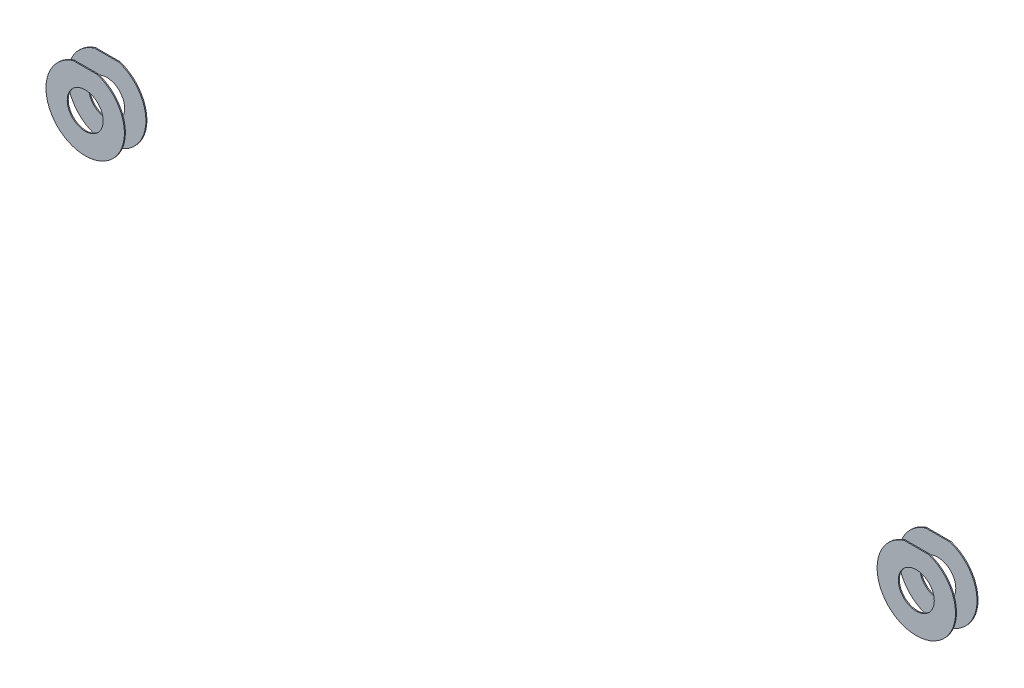
ISO-10303-21;
HEADER;
FILE_DESCRIPTION(('STEP AP214'),'2;1');
FILE_NAME('part.step','',(''),(''),'','','');
FILE_SCHEMA(('AUTOMOTIVE_DESIGN { 1 0 10303 214 1 1 1 1 }'));
ENDSEC;
DATA;
#1=APPLICATION_CONTEXT('core data for automotive mechanical design processes');
#2=APPLICATION_PROTOCOL_DEFINITION('international standard','automotive_design',2000,#1);
#3=PRODUCT_CONTEXT('',#1,'mechanical');
#4=PRODUCT('Part','Part','',(#3));
#5=PRODUCT_RELATED_PRODUCT_CATEGORY('part','',(#4));
#6=PRODUCT_DEFINITION_FORMATION('','',#4);
#7=PRODUCT_DEFINITION_CONTEXT('part definition',#1,'design');
#8=PRODUCT_DEFINITION('design','',#6,#7);
#9=PRODUCT_DEFINITION_SHAPE('','',#8);
#10=(LENGTH_UNIT() NAMED_UNIT(*) SI_UNIT(.MILLI.,.METRE.));
#11=(NAMED_UNIT(*) PLANE_ANGLE_UNIT() SI_UNIT($,.RADIAN.));
#12=(NAMED_UNIT(*) SI_UNIT($,.STERADIAN.) SOLID_ANGLE_UNIT());
#13=UNCERTAINTY_MEASURE_WITH_UNIT(LENGTH_MEASURE(1.E-05),#10,'distance_accuracy_value','');
#14=(GEOMETRIC_REPRESENTATION_CONTEXT(3) GLOBAL_UNCERTAINTY_ASSIGNED_CONTEXT((#13)) GLOBAL_UNIT_ASSIGNED_CONTEXT((#10,
#11,#12)) REPRESENTATION_CONTEXT('',''));
#15=CARTESIAN_POINT('',(0.,0.,0.));
#16=DIRECTION('',(0.,0.,1.));
#17=DIRECTION('',(1.,0.,0.));
#18=AXIS2_PLACEMENT_3D('',#15,#16,#17);
#19=CARTESIAN_POINT('',(12.19999798259,58.50079677203,0.));
#20=DIRECTION('',(0.,0.,1.));
#21=DIRECTION('',(1.,0.,0.));
#22=AXIS2_PLACEMENT_3D('',#19,#20,#21);
#23=CYLINDRICAL_SURFACE('',#22,3.000796772027);
#24=DIRECTION('',(0.,0.,1.));
#25=VECTOR('',#24,1.);
#26=CARTESIAN_POINT('',(12.2,55.5,0.));
#27=LINE('',#26,#25);
#28=CARTESIAN_POINT('',(12.2,55.5,0.));
#29=VERTEX_POINT('',#28);
#30=CARTESIAN_POINT('',(12.2,55.5,0.0762));
#31=VERTEX_POINT('',#30);
#32=EDGE_CURVE('P0_E11',#29,#31,#27,.T.);
#33=ORIENTED_EDGE('',*,*,#32,.T.);
#34=CARTESIAN_POINT('',(12.19999798259,58.50079677203,0.0762));
#35=DIRECTION('',(0.,0.,1.));
#36=DIRECTION('',(-0.918755314685112,-0.394827394867505,0.));
#37=AXIS2_PLACEMENT_3D('',#34,#35,#36);
#38=CIRCLE('',#37,3.000796772027);
#39=CARTESIAN_POINT('',(9.443,57.316,0.0762));
#40=VERTEX_POINT('',#39);
#41=EDGE_CURVE('P0_E139',#40,#31,#38,.T.);
#42=ORIENTED_EDGE('',*,*,#41,.F.);
#43=DIRECTION('',(0.,0.,1.));
#44=VECTOR('',#43,1.);
#45=CARTESIAN_POINT('',(9.443,57.316,0.));
#46=LINE('',#45,#44);
#47=CARTESIAN_POINT('',(9.443,57.316,0.));
#48=VERTEX_POINT('',#47);
#49=EDGE_CURVE('P0_E157',#48,#40,#46,.T.);
#50=ORIENTED_EDGE('',*,*,#49,.F.);
#51=CARTESIAN_POINT('',(12.19999798259,58.50079677203,0.));
#52=DIRECTION('',(0.,0.,1.));
#53=DIRECTION('',(-0.918755314685112,-0.394827394867505,0.));
#54=AXIS2_PLACEMENT_3D('',#51,#52,#53);
#55=CIRCLE('',#54,3.000796772027);
#56=EDGE_CURVE('P0_E137',#48,#29,#55,.T.);
#57=ORIENTED_EDGE('',*,*,#56,.T.);
#58=EDGE_LOOP('',(#33,#42,#50,#57));
#59=FACE_BOUND('',#58,.T.);
#60=ADVANCED_FACE('P0_F17',(#59),#23,.T.);
#61=CARTESIAN_POINT('',(12.19948571523,58.49980228312,0.));
#62=DIRECTION('',(0.,0.,1.));
#63=DIRECTION('',(1.,0.,0.));
#64=AXIS2_PLACEMENT_3D('',#61,#62,#63);
#65=CYLINDRICAL_SURFACE('',#64,2.999802327205);
#66=DIRECTION('',(0.,0.,1.));
#67=VECTOR('',#66,1.);
#68=CARTESIAN_POINT('',(13.135,61.35,0.));
#69=LINE('',#68,#67);
#70=CARTESIAN_POINT('',(13.135,61.35,0.));
#71=VERTEX_POINT('',#70);
#72=CARTESIAN_POINT('',(13.135,61.35,0.0762));
#73=VERTEX_POINT('',#72);
#74=EDGE_CURVE('P0_E28',#71,#73,#69,.T.);
#75=ORIENTED_EDGE('',*,*,#74,.T.);
#76=CARTESIAN_POINT('',(12.19948571523,58.49980228312,0.0762));
#77=DIRECTION('',(0.,0.,1.));
#78=DIRECTION('',(0.000171439551356707,-0.99999998530424,0.));
#79=AXIS2_PLACEMENT_3D('',#76,#77,#78);
#80=CIRCLE('',#79,2.999802327205);
#81=EDGE_CURVE('P0_E142',#31,#73,#80,.T.);
#82=ORIENTED_EDGE('',*,*,#81,.F.);
#83=ORIENTED_EDGE('',*,*,#32,.F.);
#84=CARTESIAN_POINT('',(12.19948571523,58.49980228312,0.));
#85=DIRECTION('',(0.,0.,1.));
#86=DIRECTION('',(0.000171439551356707,-0.99999998530424,0.));
#87=AXIS2_PLACEMENT_3D('',#84,#85,#86);
#88=CIRCLE('',#87,2.999802327205);
#89=EDGE_CURVE('P0_E123',#29,#71,#88,.T.);
#90=ORIENTED_EDGE('',*,*,#89,.T.);
#91=EDGE_LOOP('',(#75,#82,#83,#90));
#92=FACE_BOUND('',#91,.T.);
#93=ADVANCED_FACE('P0_F174',(#92),#65,.T.);
#94=CARTESIAN_POINT('',(13.135,61.35,0.));
#95=DIRECTION('',(0.,1.,0.));
#96=DIRECTION('',(1.,0.,0.));
#97=AXIS2_PLACEMENT_3D('',#94,#95,#96);
#98=PLANE('',#97);
#99=DIRECTION('',(0.,0.,1.));
#100=VECTOR('',#99,1.);
#101=CARTESIAN_POINT('',(11.264,61.35,0.));
#102=LINE('',#101,#100);
#103=CARTESIAN_POINT('',(11.264,61.35,0.));
#104=VERTEX_POINT('',#103);
#105=CARTESIAN_POINT('',(11.264,61.35,0.0762));
#106=VERTEX_POINT('',#105);
#107=EDGE_CURVE('P0_E104',#104,#106,#102,.T.);
#108=ORIENTED_EDGE('',*,*,#107,.T.);
#109=DIRECTION('',(-1.,0.,0.));
#110=VECTOR('',#109,1.);
#111=CARTESIAN_POINT('',(13.135,61.35,0.0762));
#112=LINE('',#111,#110);
#113=EDGE_CURVE('P0_E214',#73,#106,#112,.T.);
#114=ORIENTED_EDGE('',*,*,#113,.F.);
#115=ORIENTED_EDGE('',*,*,#74,.F.);
#116=DIRECTION('',(-1.,0.,0.));
#117=VECTOR('',#116,1.);
#118=CARTESIAN_POINT('',(13.135,61.35,0.));
#119=LINE('',#118,#117);
#120=EDGE_CURVE('P0_E117',#71,#104,#119,.T.);
#121=ORIENTED_EDGE('',*,*,#120,.T.);
#122=EDGE_LOOP('',(#108,#114,#115,#121));
#123=FACE_BOUND('',#122,.T.);
#124=ADVANCED_FACE('P0_F118',(#123),#98,.T.);
#125=CARTESIAN_POINT('',(12.19966170946,58.49999867778,0.));
#126=DIRECTION('',(0.,0.,1.));
#127=DIRECTION('',(1.,0.,0.));
#128=AXIS2_PLACEMENT_3D('',#125,#126,#127);
#129=CYLINDRICAL_SURFACE('',#128,2.999661709457);
#130=DIRECTION('',(0.,0.,1.));
#131=VECTOR('',#130,1.);
#132=CARTESIAN_POINT('',(9.2,58.5,0.));
#133=LINE('',#132,#131);
#134=CARTESIAN_POINT('',(9.2,58.5,0.));
#135=VERTEX_POINT('',#134);
#136=CARTESIAN_POINT('',(9.2,58.5,0.0762));
#137=VERTEX_POINT('',#136);
#138=EDGE_CURVE('P0_E42',#135,#137,#133,.T.);
#139=ORIENTED_EDGE('',*,*,#138,.T.);
#140=CARTESIAN_POINT('',(12.19966170946,58.49999867778,0.0762));
#141=DIRECTION('',(0.,0.,1.));
#142=DIRECTION('',(-0.311922409952713,0.950107578208537,0.));
#143=AXIS2_PLACEMENT_3D('',#140,#141,#142);
#144=CIRCLE('',#143,2.999661709457);
#145=EDGE_CURVE('P0_E110',#106,#137,#144,.T.);
#146=ORIENTED_EDGE('',*,*,#145,.F.);
#147=ORIENTED_EDGE('',*,*,#107,.F.);
#148=CARTESIAN_POINT('',(12.19966170946,58.49999867778,0.));
#149=DIRECTION('',(0.,0.,1.));
#150=DIRECTION('',(-0.311922409952713,0.950107578208537,0.));
#151=AXIS2_PLACEMENT_3D('',#148,#149,#150);
#152=CIRCLE('',#151,2.999661709457);
#153=EDGE_CURVE('P0_E108',#104,#135,#152,.T.);
#154=ORIENTED_EDGE('',*,*,#153,.T.);
#155=EDGE_LOOP('',(#139,#146,#147,#154));
#156=FACE_BOUND('',#155,.T.);
#157=ADVANCED_FACE('P0_F106',(#156),#129,.T.);
#158=CARTESIAN_POINT('',(12.20006855212,58.49878729575,0.));
#159=DIRECTION('',(0.,0.,1.));
#160=DIRECTION('',(1.,0.,0.));
#161=AXIS2_PLACEMENT_3D('',#158,#159,#160);
#162=CYLINDRICAL_SURFACE('',#161,3.000068797223);
#163=ORIENTED_EDGE('',*,*,#49,.T.);
#164=CARTESIAN_POINT('',(12.20006855212,58.49878729575,0.0762));
#165=DIRECTION('',(0.,0.,1.));
#166=DIRECTION('',(-0.999999918300877,0.000404225480906591,0.));
#167=AXIS2_PLACEMENT_3D('',#164,#165,#166);
#168=CIRCLE('',#167,3.000068797223);
#169=EDGE_CURVE('P0_E160',#137,#40,#168,.T.);
#170=ORIENTED_EDGE('',*,*,#169,.F.);
#171=ORIENTED_EDGE('',*,*,#138,.F.);
#172=CARTESIAN_POINT('',(12.20006855212,58.49878729575,0.));
#173=DIRECTION('',(0.,0.,1.));
#174=DIRECTION('',(-0.999999918300877,0.000404225480906591,0.));
#175=AXIS2_PLACEMENT_3D('',#172,#173,#174);
#176=CIRCLE('',#175,3.000068797223);
#177=EDGE_CURVE('P0_E127',#135,#48,#176,.T.);
#178=ORIENTED_EDGE('',*,*,#177,.T.);
#179=EDGE_LOOP('',(#163,#170,#171,#178));
#180=FACE_BOUND('',#179,.T.);
#181=ADVANCED_FACE('P0_F19',(#180),#162,.T.);
#182=CARTESIAN_POINT('',(0.,0.,0.0762));
#183=DIRECTION('',(0.,0.,1.));
#184=DIRECTION('',(1.,0.,0.));
#185=AXIS2_PLACEMENT_3D('',#182,#183,#184);
#186=PLANE('',#185);
#187=CARTESIAN_POINT('',(12.19999798259,58.50079677203,0.0762));
#188=DIRECTION('',(0.,0.,-1.));
#189=DIRECTION('',(-1.,0.,0.));
#190=AXIS2_PLACEMENT_3D('',#187,#188,#189);
#191=CIRCLE('',#190,1.375);
#192=CARTESIAN_POINT('',(10.82499798259,58.50079677203,0.0762));
#193=VERTEX_POINT('',#192);
#194=CARTESIAN_POINT('',(13.57499798259,58.50079677203,0.0762));
#195=VERTEX_POINT('',#194);
#196=EDGE_CURVE('P0_E21',#193,#195,#191,.T.);
#197=ORIENTED_EDGE('',*,*,#196,.T.);
#198=CARTESIAN_POINT('',(12.19999798259,58.50079677203,0.0762));
#199=DIRECTION('',(0.,0.,-1.));
#200=DIRECTION('',(1.,0.,0.));
#201=AXIS2_PLACEMENT_3D('',#198,#199,#200);
#202=CIRCLE('',#201,1.375);
#203=EDGE_CURVE('P0_E194',#195,#193,#202,.T.);
#204=ORIENTED_EDGE('',*,*,#203,.T.);
#205=EDGE_LOOP('',(#197,#204));
#206=FACE_BOUND('',#205,.T.);
#207=ORIENTED_EDGE('',*,*,#41,.T.);
#208=ORIENTED_EDGE('',*,*,#81,.T.);
#209=ORIENTED_EDGE('',*,*,#113,.T.);
#210=ORIENTED_EDGE('',*,*,#145,.T.);
#211=ORIENTED_EDGE('',*,*,#169,.T.);
#212=EDGE_LOOP('',(#207,#208,#209,#210,#211));
#213=FACE_BOUND('',#212,.T.);
#214=ADVANCED_FACE('P0_F163',(#206,#213),#186,.T.);
#215=CARTESIAN_POINT('',(12.19999798259,58.50079677203,0.));
#216=DIRECTION('',(0.,0.,1.));
#217=DIRECTION('',(1.,0.,0.));
#218=AXIS2_PLACEMENT_3D('',#215,#216,#217);
#219=CYLINDRICAL_SURFACE('',#218,1.375);
#220=DIRECTION('',(0.,0.,1.));
#221=VECTOR('',#220,1.);
#222=CARTESIAN_POINT('',(13.57499798259,58.50079677203,0.));
#223=LINE('',#222,#221);
#224=CARTESIAN_POINT('',(13.57499798259,58.50079677203,0.));
#225=VERTEX_POINT('',#224);
#226=EDGE_CURVE('P0_E86',#225,#195,#223,.T.);
#227=ORIENTED_EDGE('',*,*,#226,.T.);
#228=ORIENTED_EDGE('',*,*,#196,.F.);
#229=DIRECTION('',(0.,0.,1.));
#230=VECTOR('',#229,1.);
#231=CARTESIAN_POINT('',(10.82499798259,58.50079677203,0.));
#232=LINE('',#231,#230);
#233=CARTESIAN_POINT('',(10.82499798259,58.50079677203,0.));
#234=VERTEX_POINT('',#233);
#235=EDGE_CURVE('P0_E197',#234,#193,#232,.T.);
#236=ORIENTED_EDGE('',*,*,#235,.F.);
#237=CARTESIAN_POINT('',(12.19999798259,58.50079677203,0.));
#238=DIRECTION('',(0.,0.,-1.));
#239=DIRECTION('',(-1.,0.,0.));
#240=AXIS2_PLACEMENT_3D('',#237,#238,#239);
#241=CIRCLE('',#240,1.375);
#242=EDGE_CURVE('P0_E144',#234,#225,#241,.T.);
#243=ORIENTED_EDGE('',*,*,#242,.T.);
#244=EDGE_LOOP('',(#227,#228,#236,#243));
#245=FACE_BOUND('',#244,.T.);
#246=ADVANCED_FACE('P0_F170',(#245),#219,.F.);
#247=CARTESIAN_POINT('',(12.19999798259,58.50079677203,0.));
#248=DIRECTION('',(0.,0.,1.));
#249=DIRECTION('',(1.,0.,0.));
#250=AXIS2_PLACEMENT_3D('',#247,#248,#249);
#251=CYLINDRICAL_SURFACE('',#250,1.375);
#252=ORIENTED_EDGE('',*,*,#235,.T.);
#253=ORIENTED_EDGE('',*,*,#203,.F.);
#254=ORIENTED_EDGE('',*,*,#226,.F.);
#255=CARTESIAN_POINT('',(12.19999798259,58.50079677203,0.));
#256=DIRECTION('',(0.,0.,-1.));
#257=DIRECTION('',(1.,0.,0.));
#258=AXIS2_PLACEMENT_3D('',#255,#256,#257);
#259=CIRCLE('',#258,1.375);
#260=EDGE_CURVE('P0_E204',#225,#234,#259,.T.);
#261=ORIENTED_EDGE('',*,*,#260,.T.);
#262=EDGE_LOOP('',(#252,#253,#254,#261));
#263=FACE_BOUND('',#262,.T.);
#264=ADVANCED_FACE('P0_F185',(#263),#251,.F.);
#265=CARTESIAN_POINT('',(0.,0.,0.));
#266=DIRECTION('',(0.,0.,1.));
#267=DIRECTION('',(1.,0.,0.));
#268=AXIS2_PLACEMENT_3D('',#265,#266,#267);
#269=PLANE('',#268);
#270=ORIENTED_EDGE('',*,*,#242,.F.);
#271=ORIENTED_EDGE('',*,*,#260,.F.);
#272=EDGE_LOOP('',(#270,#271));
#273=FACE_BOUND('',#272,.T.);
#274=ORIENTED_EDGE('',*,*,#153,.F.);
#275=ORIENTED_EDGE('',*,*,#120,.F.);
#276=ORIENTED_EDGE('',*,*,#89,.F.);
#277=ORIENTED_EDGE('',*,*,#56,.F.);
#278=ORIENTED_EDGE('',*,*,#177,.F.);
#279=EDGE_LOOP('',(#274,#275,#276,#277,#278));
#280=FACE_BOUND('',#279,.T.);
#281=ADVANCED_FACE('P0_F125',(#273,#280),#269,.F.);
#282=CLOSED_SHELL('',(#60,#93,#124,#157,#181,#214,#246,#264,#281));
#283=MANIFOLD_SOLID_BREP('P0_B1',#282);
#284=CARTESIAN_POINT('',(75.80006855212,58.49878729575,0.));
#285=DIRECTION('',(0.,0.,1.));
#286=DIRECTION('',(1.,0.,0.));
#287=AXIS2_PLACEMENT_3D('',#284,#285,#286);
#288=CYLINDRICAL_SURFACE('',#287,3.000068797223);
#289=DIRECTION('',(0.,0.,1.));
#290=VECTOR('',#289,1.);
#291=CARTESIAN_POINT('',(73.043,57.316,0.));
#292=LINE('',#291,#290);
#293=CARTESIAN_POINT('',(73.043,57.316,0.));
#294=VERTEX_POINT('',#293);
#295=CARTESIAN_POINT('',(73.043,57.316,0.0762));
#296=VERTEX_POINT('',#295);
#297=EDGE_CURVE('P1_E11',#294,#296,#292,.T.);
#298=ORIENTED_EDGE('',*,*,#297,.T.);
#299=CARTESIAN_POINT('',(75.80006855212,58.49878729575,0.0762));
#300=DIRECTION('',(0.,0.,1.));
#301=DIRECTION('',(-0.999999918300877,0.000404225480897091,0.));
#302=AXIS2_PLACEMENT_3D('',#299,#300,#301);
#303=CIRCLE('',#302,3.000068797223);
#304=CARTESIAN_POINT('',(72.8,58.5,0.0762));
#305=VERTEX_POINT('',#304);
#306=EDGE_CURVE('P1_E118',#305,#296,#303,.T.);
#307=ORIENTED_EDGE('',*,*,#306,.F.);
#308=DIRECTION('',(0.,0.,1.));
#309=VECTOR('',#308,1.);
#310=CARTESIAN_POINT('',(72.8,58.5,0.));
#311=LINE('',#310,#309);
#312=CARTESIAN_POINT('',(72.8,58.5,0.));
#313=VERTEX_POINT('',#312);
#314=EDGE_CURVE('P1_E91',#313,#305,#311,.T.);
#315=ORIENTED_EDGE('',*,*,#314,.F.);
#316=CARTESIAN_POINT('',(75.80006855212,58.49878729575,0.));
#317=DIRECTION('',(0.,0.,1.));
#318=DIRECTION('',(-0.999999918300877,0.000404225480897091,0.));
#319=AXIS2_PLACEMENT_3D('',#316,#317,#318);
#320=CIRCLE('',#319,3.000068797223);
#321=EDGE_CURVE('P1_E115',#313,#294,#320,.T.);
#322=ORIENTED_EDGE('',*,*,#321,.T.);
#323=EDGE_LOOP('',(#298,#307,#315,#322));
#324=FACE_BOUND('',#323,.T.);
#325=ADVANCED_FACE('P1_F17',(#324),#288,.T.);
#326=CARTESIAN_POINT('',(75.79999798259,58.50079677203,0.));
#327=DIRECTION('',(0.,0.,1.));
#328=DIRECTION('',(1.,0.,0.));
#329=AXIS2_PLACEMENT_3D('',#326,#327,#328);
#330=CYLINDRICAL_SURFACE('',#329,3.000796772027);
#331=DIRECTION('',(0.,0.,1.));
#332=VECTOR('',#331,1.);
#333=CARTESIAN_POINT('',(75.8,55.5,0.));
#334=LINE('',#333,#332);
#335=CARTESIAN_POINT('',(75.8,55.5,0.));
#336=VERTEX_POINT('',#335);
#337=CARTESIAN_POINT('',(75.8,55.5,0.0762));
#338=VERTEX_POINT('',#337);
#339=EDGE_CURVE('P1_E26',#336,#338,#334,.T.);
#340=ORIENTED_EDGE('',*,*,#339,.T.);
#341=CARTESIAN_POINT('',(75.79999798259,58.50079677203,0.0762));
#342=DIRECTION('',(0.,0.,1.));
#343=DIRECTION('',(-0.918755314685112,-0.394827394867505,0.));
#344=AXIS2_PLACEMENT_3D('',#341,#342,#343);
#345=CIRCLE('',#344,3.000796772027);
#346=EDGE_CURVE('P1_E149',#296,#338,#345,.T.);
#347=ORIENTED_EDGE('',*,*,#346,.F.);
#348=ORIENTED_EDGE('',*,*,#297,.F.);
#349=CARTESIAN_POINT('',(75.79999798259,58.50079677203,0.));
#350=DIRECTION('',(0.,0.,1.));
#351=DIRECTION('',(-0.918755314685112,-0.394827394867505,0.));
#352=AXIS2_PLACEMENT_3D('',#349,#350,#351);
#353=CIRCLE('',#352,3.000796772027);
#354=EDGE_CURVE('P1_E133',#294,#336,#353,.T.);
#355=ORIENTED_EDGE('',*,*,#354,.T.);
#356=EDGE_LOOP('',(#340,#347,#348,#355));
#357=FACE_BOUND('',#356,.T.);
#358=ADVANCED_FACE('P1_F209',(#357),#330,.T.);
#359=CARTESIAN_POINT('',(75.79948571523,58.49980228312,0.));
#360=DIRECTION('',(0.,0.,1.));
#361=DIRECTION('',(1.,0.,0.));
#362=AXIS2_PLACEMENT_3D('',#359,#360,#361);
#363=CYLINDRICAL_SURFACE('',#362,2.999802327205);
#364=DIRECTION('',(0.,0.,1.));
#365=VECTOR('',#364,1.);
#366=CARTESIAN_POINT('',(76.735,61.35,0.));
#367=LINE('',#366,#365);
#368=CARTESIAN_POINT('',(76.735,61.35,0.));
#369=VERTEX_POINT('',#368);
#370=CARTESIAN_POINT('',(76.735,61.35,0.0762));
#371=VERTEX_POINT('',#370);
#372=EDGE_CURVE('P1_E52',#369,#371,#367,.T.);
#373=ORIENTED_EDGE('',*,*,#372,.T.);
#374=CARTESIAN_POINT('',(75.79948571523,58.49980228312,0.0762));
#375=DIRECTION('',(0.,0.,1.));
#376=DIRECTION('',(0.000171439551360307,-0.99999998530424,0.));
#377=AXIS2_PLACEMENT_3D('',#374,#375,#376);
#378=CIRCLE('',#377,2.999802327205);
#379=EDGE_CURVE('P1_E153',#338,#371,#378,.T.);
#380=ORIENTED_EDGE('',*,*,#379,.F.);
#381=ORIENTED_EDGE('',*,*,#339,.F.);
#382=CARTESIAN_POINT('',(75.79948571523,58.49980228312,0.));
#383=DIRECTION('',(0.,0.,1.));
#384=DIRECTION('',(0.000171439551360307,-0.99999998530424,0.));
#385=AXIS2_PLACEMENT_3D('',#382,#383,#384);
#386=CIRCLE('',#385,2.999802327205);
#387=EDGE_CURVE('P1_E142',#336,#369,#386,.T.);
#388=ORIENTED_EDGE('',*,*,#387,.T.);
#389=EDGE_LOOP('',(#373,#380,#381,#388));
#390=FACE_BOUND('',#389,.T.);
#391=ADVANCED_FACE('P1_F214',(#390),#363,.T.);
#392=CARTESIAN_POINT('',(76.735,61.35,0.));
#393=DIRECTION('',(0.,1.,0.));
#394=DIRECTION('',(1.,0.,0.));
#395=AXIS2_PLACEMENT_3D('',#392,#393,#394);
#396=PLANE('',#395);
#397=DIRECTION('',(0.,0.,1.));
#398=VECTOR('',#397,1.);
#399=CARTESIAN_POINT('',(74.864,61.35,0.));
#400=LINE('',#399,#398);
#401=CARTESIAN_POINT('',(74.864,61.35,0.));
#402=VERTEX_POINT('',#401);
#403=CARTESIAN_POINT('',(74.864,61.35,0.0762));
#404=VERTEX_POINT('',#403);
#405=EDGE_CURVE('P1_E39',#402,#404,#400,.T.);
#406=ORIENTED_EDGE('',*,*,#405,.T.);
#407=DIRECTION('',(-1.,0.,0.));
#408=VECTOR('',#407,1.);
#409=CARTESIAN_POINT('',(76.735,61.35,0.0762));
#410=LINE('',#409,#408);
#411=EDGE_CURVE('P1_E156',#371,#404,#410,.T.);
#412=ORIENTED_EDGE('',*,*,#411,.F.);
#413=ORIENTED_EDGE('',*,*,#372,.F.);
#414=DIRECTION('',(-1.,0.,0.));
#415=VECTOR('',#414,1.);
#416=CARTESIAN_POINT('',(76.735,61.35,0.));
#417=LINE('',#416,#415);
#418=EDGE_CURVE('P1_E147',#369,#402,#417,.T.);
#419=ORIENTED_EDGE('',*,*,#418,.T.);
#420=EDGE_LOOP('',(#406,#412,#413,#419));
#421=FACE_BOUND('',#420,.T.);
#422=ADVANCED_FACE('P1_F219',(#421),#396,.T.);
#423=CARTESIAN_POINT('',(75.79966170946,58.49999867778,0.));
#424=DIRECTION('',(0.,0.,1.));
#425=DIRECTION('',(1.,0.,0.));
#426=AXIS2_PLACEMENT_3D('',#423,#424,#425);
#427=CYLINDRICAL_SURFACE('',#426,2.999661709457);
#428=ORIENTED_EDGE('',*,*,#314,.T.);
#429=CARTESIAN_POINT('',(75.79966170946,58.49999867778,0.0762));
#430=DIRECTION('',(0.,0.,1.));
#431=DIRECTION('',(-0.311922409952713,0.950107578208537,0.));
#432=AXIS2_PLACEMENT_3D('',#429,#430,#431);
#433=CIRCLE('',#432,2.999661709457);
#434=EDGE_CURVE('P1_E120',#404,#305,#433,.T.);
#435=ORIENTED_EDGE('',*,*,#434,.F.);
#436=ORIENTED_EDGE('',*,*,#405,.F.);
#437=CARTESIAN_POINT('',(75.79966170946,58.49999867778,0.));
#438=DIRECTION('',(0.,0.,1.));
#439=DIRECTION('',(-0.311922409952713,0.950107578208537,0.));
#440=AXIS2_PLACEMENT_3D('',#437,#438,#439);
#441=CIRCLE('',#440,2.999661709457);
#442=EDGE_CURVE('P1_E123',#402,#313,#441,.T.);
#443=ORIENTED_EDGE('',*,*,#442,.T.);
#444=EDGE_LOOP('',(#428,#435,#436,#443));
#445=FACE_BOUND('',#444,.T.);
#446=ADVANCED_FACE('P1_F124',(#445),#427,.T.);
#447=CARTESIAN_POINT('',(0.,0.,0.0762));
#448=DIRECTION('',(0.,0.,1.));
#449=DIRECTION('',(1.,0.,0.));
#450=AXIS2_PLACEMENT_3D('',#447,#448,#449);
#451=PLANE('',#450);
#452=CARTESIAN_POINT('',(75.80006855212,58.49878729575,0.0762));
#453=DIRECTION('',(0.,0.,-1.));
#454=DIRECTION('',(-1.,0.,0.));
#455=AXIS2_PLACEMENT_3D('',#452,#453,#454);
#456=CIRCLE('',#455,1.375);
#457=CARTESIAN_POINT('',(74.42506855212,58.49878729575,0.0762));
#458=VERTEX_POINT('',#457);
#459=CARTESIAN_POINT('',(77.17506855212,58.49878729575,0.0762));
#460=VERTEX_POINT('',#459);
#461=EDGE_CURVE('P1_E99',#458,#460,#456,.T.);
#462=ORIENTED_EDGE('',*,*,#461,.T.);
#463=CARTESIAN_POINT('',(75.80006855212,58.49878729575,0.0762));
#464=DIRECTION('',(0.,0.,-1.));
#465=DIRECTION('',(1.,0.,0.));
#466=AXIS2_PLACEMENT_3D('',#463,#464,#465);
#467=CIRCLE('',#466,1.375);
#468=EDGE_CURVE('P1_E164',#460,#458,#467,.T.);
#469=ORIENTED_EDGE('',*,*,#468,.T.);
#470=EDGE_LOOP('',(#462,#469));
#471=FACE_BOUND('',#470,.T.);
#472=ORIENTED_EDGE('',*,*,#306,.T.);
#473=ORIENTED_EDGE('',*,*,#346,.T.);
#474=ORIENTED_EDGE('',*,*,#379,.T.);
#475=ORIENTED_EDGE('',*,*,#411,.T.);
#476=ORIENTED_EDGE('',*,*,#434,.T.);
#477=EDGE_LOOP('',(#472,#473,#474,#475,#476));
#478=FACE_BOUND('',#477,.T.);
#479=ADVANCED_FACE('P1_F221',(#471,#478),#451,.T.);
#480=CARTESIAN_POINT('',(75.80006855212,58.49878729575,0.));
#481=DIRECTION('',(0.,0.,1.));
#482=DIRECTION('',(1.,0.,0.));
#483=AXIS2_PLACEMENT_3D('',#480,#481,#482);
#484=CYLINDRICAL_SURFACE('',#483,1.375);
#485=DIRECTION('',(0.,0.,1.));
#486=VECTOR('',#485,1.);
#487=CARTESIAN_POINT('',(77.17506855212,58.49878729575,0.));
#488=LINE('',#487,#486);
#489=CARTESIAN_POINT('',(77.17506855212,58.49878729575,0.));
#490=VERTEX_POINT('',#489);
#491=EDGE_CURVE('P1_E20',#490,#460,#488,.T.);
#492=ORIENTED_EDGE('',*,*,#491,.T.);
#493=ORIENTED_EDGE('',*,*,#461,.F.);
#494=DIRECTION('',(0.,0.,1.));
#495=VECTOR('',#494,1.);
#496=CARTESIAN_POINT('',(74.42506855212,58.49878729575,0.));
#497=LINE('',#496,#495);
#498=CARTESIAN_POINT('',(74.42506855212,58.49878729575,0.));
#499=VERTEX_POINT('',#498);
#500=EDGE_CURVE('P1_E108',#499,#458,#497,.T.);
#501=ORIENTED_EDGE('',*,*,#500,.F.);
#502=CARTESIAN_POINT('',(75.80006855212,58.49878729575,0.));
#503=DIRECTION('',(0.,0.,-1.));
#504=DIRECTION('',(-1.,0.,0.));
#505=AXIS2_PLACEMENT_3D('',#502,#503,#504);
#506=CIRCLE('',#505,1.375);
#507=EDGE_CURVE('P1_E128',#499,#490,#506,.T.);
#508=ORIENTED_EDGE('',*,*,#507,.T.);
#509=EDGE_LOOP('',(#492,#493,#501,#508));
#510=FACE_BOUND('',#509,.T.);
#511=ADVANCED_FACE('P1_F192',(#510),#484,.F.);
#512=CARTESIAN_POINT('',(75.80006855212,58.49878729575,0.));
#513=DIRECTION('',(0.,0.,1.));
#514=DIRECTION('',(1.,0.,0.));
#515=AXIS2_PLACEMENT_3D('',#512,#513,#514);
#516=CYLINDRICAL_SURFACE('',#515,1.375);
#517=ORIENTED_EDGE('',*,*,#500,.T.);
#518=ORIENTED_EDGE('',*,*,#468,.F.);
#519=ORIENTED_EDGE('',*,*,#491,.F.);
#520=CARTESIAN_POINT('',(75.80006855212,58.49878729575,0.));
#521=DIRECTION('',(0.,0.,-1.));
#522=DIRECTION('',(1.,0.,0.));
#523=AXIS2_PLACEMENT_3D('',#520,#521,#522);
#524=CIRCLE('',#523,1.375);
#525=EDGE_CURVE('P1_E159',#490,#499,#524,.T.);
#526=ORIENTED_EDGE('',*,*,#525,.T.);
#527=EDGE_LOOP('',(#517,#518,#519,#526));
#528=FACE_BOUND('',#527,.T.);
#529=ADVANCED_FACE('P1_F196',(#528),#516,.F.);
#530=CARTESIAN_POINT('',(0.,0.,0.));
#531=DIRECTION('',(0.,0.,1.));
#532=DIRECTION('',(1.,0.,0.));
#533=AXIS2_PLACEMENT_3D('',#530,#531,#532);
#534=PLANE('',#533);
#535=ORIENTED_EDGE('',*,*,#507,.F.);
#536=ORIENTED_EDGE('',*,*,#525,.F.);
#537=EDGE_LOOP('',(#535,#536));
#538=FACE_BOUND('',#537,.T.);
#539=ORIENTED_EDGE('',*,*,#418,.F.);
#540=ORIENTED_EDGE('',*,*,#387,.F.);
#541=ORIENTED_EDGE('',*,*,#354,.F.);
#542=ORIENTED_EDGE('',*,*,#321,.F.);
#543=ORIENTED_EDGE('',*,*,#442,.F.);
#544=EDGE_LOOP('',(#539,#540,#541,#542,#543));
#545=FACE_BOUND('',#544,.T.);
#546=ADVANCED_FACE('P1_F130',(#538,#545),#534,.F.);
#547=CLOSED_SHELL('',(#325,#358,#391,#422,#446,#479,#511,#529,#546));
#548=MANIFOLD_SOLID_BREP('P1_B1',#547);
#549=CARTESIAN_POINT('',(75.80006855212,58.49878729575,-1.57));
#550=DIRECTION('',(0.,0.,1.));
#551=DIRECTION('',(-1.,0.,0.));
#552=AXIS2_PLACEMENT_3D('',#549,#550,#551);
#553=CYLINDRICAL_SURFACE('',#552,1.375);
#554=DIRECTION('',(0.,0.,-1.));
#555=VECTOR('',#554,1.);
#556=CARTESIAN_POINT('',(77.17506855212,58.49878729575,-1.57));
#557=LINE('',#556,#555);
#558=CARTESIAN_POINT('',(77.17506855212,58.49878729575,-1.57));
#559=VERTEX_POINT('',#558);
#560=CARTESIAN_POINT('',(77.17506855212,58.49878729575,-1.6462));
#561=VERTEX_POINT('',#560);
#562=EDGE_CURVE('P2_E11',#559,#561,#557,.T.);
#563=ORIENTED_EDGE('',*,*,#562,.T.);
#564=CARTESIAN_POINT('',(75.80006855212,58.49878729575,-1.6462));
#565=DIRECTION('',(0.,0.,-1.));
#566=DIRECTION('',(1.,0.,0.));
#567=AXIS2_PLACEMENT_3D('',#564,#565,#566);
#568=CIRCLE('',#567,1.375);
#569=CARTESIAN_POINT('',(74.42506855212,58.49878729575,-1.6462));
#570=VERTEX_POINT('',#569);
#571=EDGE_CURVE('P2_E115',#561,#570,#568,.T.);
#572=ORIENTED_EDGE('',*,*,#571,.T.);
#573=DIRECTION('',(0.,0.,-1.));
#574=VECTOR('',#573,1.);
#575=CARTESIAN_POINT('',(74.42506855212,58.49878729575,-1.57));
#576=LINE('',#575,#574);
#577=CARTESIAN_POINT('',(74.42506855212,58.49878729575,-1.57));
#578=VERTEX_POINT('',#577);
#579=EDGE_CURVE('P2_E28',#578,#570,#576,.T.);
#580=ORIENTED_EDGE('',*,*,#579,.F.);
#581=CARTESIAN_POINT('',(75.80006855212,58.49878729575,-1.57));
#582=DIRECTION('',(0.,0.,-1.));
#583=DIRECTION('',(1.,0.,0.));
#584=AXIS2_PLACEMENT_3D('',#581,#582,#583);
#585=CIRCLE('',#584,1.375);
#586=EDGE_CURVE('P2_E161',#559,#578,#585,.T.);
#587=ORIENTED_EDGE('',*,*,#586,.F.);
#588=EDGE_LOOP('',(#563,#572,#580,#587));
#589=FACE_BOUND('',#588,.T.);
#590=ADVANCED_FACE('P2_F17',(#589),#553,.F.);
#591=CARTESIAN_POINT('',(75.80006855212,58.49878729575,-1.57));
#592=DIRECTION('',(0.,0.,1.));
#593=DIRECTION('',(-1.,0.,0.));
#594=AXIS2_PLACEMENT_3D('',#591,#592,#593);
#595=CYLINDRICAL_SURFACE('',#594,1.375);
#596=ORIENTED_EDGE('',*,*,#579,.T.);
#597=CARTESIAN_POINT('',(75.80006855212,58.49878729575,-1.6462));
#598=DIRECTION('',(0.,0.,-1.));
#599=DIRECTION('',(-1.,0.,0.));
#600=AXIS2_PLACEMENT_3D('',#597,#598,#599);
#601=CIRCLE('',#600,1.375);
#602=EDGE_CURVE('P2_E142',#570,#561,#601,.T.);
#603=ORIENTED_EDGE('',*,*,#602,.T.);
#604=ORIENTED_EDGE('',*,*,#562,.F.);
#605=CARTESIAN_POINT('',(75.80006855212,58.49878729575,-1.57));
#606=DIRECTION('',(0.,0.,-1.));
#607=DIRECTION('',(-1.,0.,0.));
#608=AXIS2_PLACEMENT_3D('',#605,#606,#607);
#609=CIRCLE('',#608,1.375);
#610=EDGE_CURVE('P2_E160',#578,#559,#609,.T.);
#611=ORIENTED_EDGE('',*,*,#610,.F.);
#612=EDGE_LOOP('',(#596,#603,#604,#611));
#613=FACE_BOUND('',#612,.T.);
#614=ADVANCED_FACE('P2_F246',(#613),#595,.F.);
#615=CARTESIAN_POINT('',(0.,0.,-1.6462));
#616=DIRECTION('',(0.,0.,1.));
#617=DIRECTION('',(1.,0.,0.));
#618=AXIS2_PLACEMENT_3D('',#615,#616,#617);
#619=PLANE('',#618);
#620=ORIENTED_EDGE('',*,*,#571,.F.);
#621=ORIENTED_EDGE('',*,*,#602,.F.);
#622=EDGE_LOOP('',(#620,#621));
#623=FACE_BOUND('',#622,.T.);
#624=CARTESIAN_POINT('',(75.80006855212,58.49878729575,-1.6462));
#625=DIRECTION('',(0.,0.,1.));
#626=DIRECTION('',(-0.999999918300877,0.000404225480897091,0.));
#627=AXIS2_PLACEMENT_3D('',#624,#625,#626);
#628=CIRCLE('',#627,3.000068797223);
#629=CARTESIAN_POINT('',(72.8,58.5,-1.6462));
#630=VERTEX_POINT('',#629);
#631=CARTESIAN_POINT('',(73.043,57.316,-1.6462));
#632=VERTEX_POINT('',#631);
#633=EDGE_CURVE('P2_E104',#630,#632,#628,.T.);
#634=ORIENTED_EDGE('',*,*,#633,.F.);
#635=CARTESIAN_POINT('',(75.79966170946,58.49999867778,-1.6462));
#636=DIRECTION('',(0.,0.,1.));
#637=DIRECTION('',(-0.311922409952713,0.950107578208537,0.));
#638=AXIS2_PLACEMENT_3D('',#635,#636,#637);
#639=CIRCLE('',#638,2.999661709457);
#640=CARTESIAN_POINT('',(74.864,61.35,-1.6462));
#641=VERTEX_POINT('',#640);
#642=EDGE_CURVE('P2_E109',#641,#630,#639,.T.);
#643=ORIENTED_EDGE('',*,*,#642,.F.);
#644=DIRECTION('',(-1.,0.,0.));
#645=VECTOR('',#644,1.);
#646=CARTESIAN_POINT('',(76.735,61.35,-1.6462));
#647=LINE('',#646,#645);
#648=CARTESIAN_POINT('',(76.735,61.35,-1.6462));
#649=VERTEX_POINT('',#648);
#650=EDGE_CURVE('P2_E136',#649,#641,#647,.T.);
#651=ORIENTED_EDGE('',*,*,#650,.F.);
#652=CARTESIAN_POINT('',(75.79948571523,58.49980228312,-1.6462));
#653=DIRECTION('',(0.,0.,1.));
#654=DIRECTION('',(0.000171439551355607,-0.99999998530424,0.));
#655=AXIS2_PLACEMENT_3D('',#652,#653,#654);
#656=CIRCLE('',#655,2.999802327205);
#657=CARTESIAN_POINT('',(75.8,55.5,-1.6462));
#658=VERTEX_POINT('',#657);
#659=EDGE_CURVE('P2_E155',#658,#649,#656,.T.);
#660=ORIENTED_EDGE('',*,*,#659,.F.);
#661=CARTESIAN_POINT('',(75.79999798259,58.50079677203,-1.6462));
#662=DIRECTION('',(0.,0.,1.));
#663=DIRECTION('',(-0.918755314685112,-0.394827394867505,0.));
#664=AXIS2_PLACEMENT_3D('',#661,#662,#663);
#665=CIRCLE('',#664,3.000796772027);
#666=EDGE_CURVE('P2_E111',#632,#658,#665,.T.);
#667=ORIENTED_EDGE('',*,*,#666,.F.);
#668=EDGE_LOOP('',(#634,#643,#651,#660,#667));
#669=FACE_BOUND('',#668,.T.);
#670=ADVANCED_FACE('P2_F106',(#623,#669),#619,.F.);
#671=CARTESIAN_POINT('',(75.80006855212,58.49878729575,-1.57));
#672=DIRECTION('',(0.,0.,1.));
#673=DIRECTION('',(-1.,0.,0.));
#674=AXIS2_PLACEMENT_3D('',#671,#672,#673);
#675=CYLINDRICAL_SURFACE('',#674,3.000068797223);
#676=DIRECTION('',(0.,0.,-1.));
#677=VECTOR('',#676,1.);
#678=CARTESIAN_POINT('',(72.8,58.5,-1.57));
#679=LINE('',#678,#677);
#680=CARTESIAN_POINT('',(72.8,58.5,-1.57));
#681=VERTEX_POINT('',#680);
#682=EDGE_CURVE('P2_E116',#681,#630,#679,.T.);
#683=ORIENTED_EDGE('',*,*,#682,.T.);
#684=ORIENTED_EDGE('',*,*,#633,.T.);
#685=DIRECTION('',(0.,0.,-1.));
#686=VECTOR('',#685,1.);
#687=CARTESIAN_POINT('',(73.043,57.316,-1.57));
#688=LINE('',#687,#686);
#689=CARTESIAN_POINT('',(73.043,57.316,-1.57));
#690=VERTEX_POINT('',#689);
#691=EDGE_CURVE('P2_E146',#690,#632,#688,.T.);
#692=ORIENTED_EDGE('',*,*,#691,.F.);
#693=CARTESIAN_POINT('',(75.80006855212,58.49878729575,-1.57));
#694=DIRECTION('',(0.,0.,1.));
#695=DIRECTION('',(-0.999999918300877,0.000404225480897091,0.));
#696=AXIS2_PLACEMENT_3D('',#693,#694,#695);
#697=CIRCLE('',#696,3.000068797223);
#698=EDGE_CURVE('P2_E121',#681,#690,#697,.T.);
#699=ORIENTED_EDGE('',*,*,#698,.F.);
#700=EDGE_LOOP('',(#683,#684,#692,#699));
#701=FACE_BOUND('',#700,.T.);
#702=ADVANCED_FACE('P2_F119',(#701),#675,.T.);
#703=CARTESIAN_POINT('',(75.79966170946,58.49999867778,-1.57));
#704=DIRECTION('',(0.,0.,1.));
#705=DIRECTION('',(-1.,0.,0.));
#706=AXIS2_PLACEMENT_3D('',#703,#704,#705);
#707=CYLINDRICAL_SURFACE('',#706,2.999661709457);
#708=DIRECTION('',(0.,0.,-1.));
#709=VECTOR('',#708,1.);
#710=CARTESIAN_POINT('',(74.864,61.35,-1.57));
#711=LINE('',#710,#709);
#712=CARTESIAN_POINT('',(74.864,61.35,-1.57));
#713=VERTEX_POINT('',#712);
#714=EDGE_CURVE('P2_E128',#713,#641,#711,.T.);
#715=ORIENTED_EDGE('',*,*,#714,.T.);
#716=ORIENTED_EDGE('',*,*,#642,.T.);
#717=ORIENTED_EDGE('',*,*,#682,.F.);
#718=CARTESIAN_POINT('',(75.79966170946,58.49999867778,-1.57));
#719=DIRECTION('',(0.,0.,1.));
#720=DIRECTION('',(-0.311922409952713,0.950107578208537,0.));
#721=AXIS2_PLACEMENT_3D('',#718,#719,#720);
#722=CIRCLE('',#721,2.999661709457);
#723=EDGE_CURVE('P2_E141',#713,#681,#722,.T.);
#724=ORIENTED_EDGE('',*,*,#723,.F.);
#725=EDGE_LOOP('',(#715,#716,#717,#724));
#726=FACE_BOUND('',#725,.T.);
#727=ADVANCED_FACE('P2_F127',(#726),#707,.T.);
#728=CARTESIAN_POINT('',(76.735,61.35,-1.57));
#729=DIRECTION('',(0.,1.,0.));
#730=DIRECTION('',(1.,0.,0.));
#731=AXIS2_PLACEMENT_3D('',#728,#729,#730);
#732=PLANE('',#731);
#733=DIRECTION('',(0.,0.,-1.));
#734=VECTOR('',#733,1.);
#735=CARTESIAN_POINT('',(76.735,61.35,-1.57));
#736=LINE('',#735,#734);
#737=CARTESIAN_POINT('',(76.735,61.35,-1.57));
#738=VERTEX_POINT('',#737);
#739=EDGE_CURVE('P2_E59',#738,#649,#736,.T.);
#740=ORIENTED_EDGE('',*,*,#739,.T.);
#741=ORIENTED_EDGE('',*,*,#650,.T.);
#742=ORIENTED_EDGE('',*,*,#714,.F.);
#743=DIRECTION('',(-1.,0.,0.));
#744=VECTOR('',#743,1.);
#745=CARTESIAN_POINT('',(76.735,61.35,-1.57));
#746=LINE('',#745,#744);
#747=EDGE_CURVE('P2_E148',#738,#713,#746,.T.);
#748=ORIENTED_EDGE('',*,*,#747,.F.);
#749=EDGE_LOOP('',(#740,#741,#742,#748));
#750=FACE_BOUND('',#749,.T.);
#751=ADVANCED_FACE('P2_F184',(#750),#732,.T.);
#752=CARTESIAN_POINT('',(75.79948571523,58.49980228312,-1.57));
#753=DIRECTION('',(0.,0.,1.));
#754=DIRECTION('',(-1.,0.,0.));
#755=AXIS2_PLACEMENT_3D('',#752,#753,#754);
#756=CYLINDRICAL_SURFACE('',#755,2.999802327205);
#757=DIRECTION('',(0.,0.,-1.));
#758=VECTOR('',#757,1.);
#759=CARTESIAN_POINT('',(75.8,55.5,-1.57));
#760=LINE('',#759,#758);
#761=CARTESIAN_POINT('',(75.8,55.5,-1.57));
#762=VERTEX_POINT('',#761);
#763=EDGE_CURVE('P2_E73',#762,#658,#760,.T.);
#764=ORIENTED_EDGE('',*,*,#763,.T.);
#765=ORIENTED_EDGE('',*,*,#659,.T.);
#766=ORIENTED_EDGE('',*,*,#739,.F.);
#767=CARTESIAN_POINT('',(75.79948571523,58.49980228312,-1.57));
#768=DIRECTION('',(0.,0.,1.));
#769=DIRECTION('',(0.000171439551355607,-0.99999998530424,0.));
#770=AXIS2_PLACEMENT_3D('',#767,#768,#769);
#771=CIRCLE('',#770,2.999802327205);
#772=EDGE_CURVE('P2_E152',#762,#738,#771,.T.);
#773=ORIENTED_EDGE('',*,*,#772,.F.);
#774=EDGE_LOOP('',(#764,#765,#766,#773));
#775=FACE_BOUND('',#774,.T.);
#776=ADVANCED_FACE('P2_F232',(#775),#756,.T.);
#777=CARTESIAN_POINT('',(75.79999798259,58.50079677203,-1.57));
#778=DIRECTION('',(0.,0.,1.));
#779=DIRECTION('',(-1.,0.,0.));
#780=AXIS2_PLACEMENT_3D('',#777,#778,#779);
#781=CYLINDRICAL_SURFACE('',#780,3.000796772027);
#782=ORIENTED_EDGE('',*,*,#691,.T.);
#783=ORIENTED_EDGE('',*,*,#666,.T.);
#784=ORIENTED_EDGE('',*,*,#763,.F.);
#785=CARTESIAN_POINT('',(75.79999798259,58.50079677203,-1.57));
#786=DIRECTION('',(0.,0.,1.));
#787=DIRECTION('',(-0.918755314685112,-0.394827394867505,0.));
#788=AXIS2_PLACEMENT_3D('',#785,#786,#787);
#789=CIRCLE('',#788,3.000796772027);
#790=EDGE_CURVE('P2_E21',#690,#762,#789,.T.);
#791=ORIENTED_EDGE('',*,*,#790,.F.);
#792=EDGE_LOOP('',(#782,#783,#784,#791));
#793=FACE_BOUND('',#792,.T.);
#794=ADVANCED_FACE('P2_F19',(#793),#781,.T.);
#795=CARTESIAN_POINT('',(0.,0.,-1.57));
#796=DIRECTION('',(0.,0.,1.));
#797=DIRECTION('',(1.,0.,0.));
#798=AXIS2_PLACEMENT_3D('',#795,#796,#797);
#799=PLANE('',#798);
#800=ORIENTED_EDGE('',*,*,#586,.T.);
#801=ORIENTED_EDGE('',*,*,#610,.T.);
#802=EDGE_LOOP('',(#800,#801));
#803=FACE_BOUND('',#802,.T.);
#804=ORIENTED_EDGE('',*,*,#772,.T.);
#805=ORIENTED_EDGE('',*,*,#747,.T.);
#806=ORIENTED_EDGE('',*,*,#723,.T.);
#807=ORIENTED_EDGE('',*,*,#698,.T.);
#808=ORIENTED_EDGE('',*,*,#790,.T.);
#809=EDGE_LOOP('',(#804,#805,#806,#807,#808));
#810=FACE_BOUND('',#809,.T.);
#811=ADVANCED_FACE('P2_F234',(#803,#810),#799,.T.);
#812=CLOSED_SHELL('',(#590,#614,#670,#702,#727,#751,#776,#794,#811));
#813=MANIFOLD_SOLID_BREP('P2_B1',#812);
#814=CARTESIAN_POINT('',(12.19999798259,58.50079677203,-1.57));
#815=DIRECTION('',(0.,0.,1.));
#816=DIRECTION('',(-1.,0.,0.));
#817=AXIS2_PLACEMENT_3D('',#814,#815,#816);
#818=CYLINDRICAL_SURFACE('',#817,1.375);
#819=DIRECTION('',(0.,0.,-1.));
#820=VECTOR('',#819,1.);
#821=CARTESIAN_POINT('',(13.57499798259,58.50079677203,-1.57));
#822=LINE('',#821,#820);
#823=CARTESIAN_POINT('',(13.57499798259,58.50079677203,-1.57));
#824=VERTEX_POINT('',#823);
#825=CARTESIAN_POINT('',(13.57499798259,58.50079677203,-1.6462));
#826=VERTEX_POINT('',#825);
#827=EDGE_CURVE('P3_E11',#824,#826,#822,.T.);
#828=ORIENTED_EDGE('',*,*,#827,.T.);
#829=CARTESIAN_POINT('',(12.19999798259,58.50079677203,-1.6462));
#830=DIRECTION('',(0.,0.,-1.));
#831=DIRECTION('',(1.,0.,0.));
#832=AXIS2_PLACEMENT_3D('',#829,#830,#831);
#833=CIRCLE('',#832,1.375);
#834=CARTESIAN_POINT('',(10.82499798259,58.50079677203,-1.6462));
#835=VERTEX_POINT('',#834);
#836=EDGE_CURVE('P3_E100',#826,#835,#833,.T.);
#837=ORIENTED_EDGE('',*,*,#836,.T.);
#838=DIRECTION('',(0.,0.,-1.));
#839=VECTOR('',#838,1.);
#840=CARTESIAN_POINT('',(10.82499798259,58.50079677203,-1.57));
#841=LINE('',#840,#839);
#842=CARTESIAN_POINT('',(10.82499798259,58.50079677203,-1.57));
#843=VERTEX_POINT('',#842);
#844=EDGE_CURVE('P3_E28',#843,#835,#841,.T.);
#845=ORIENTED_EDGE('',*,*,#844,.F.);
#846=CARTESIAN_POINT('',(12.19999798259,58.50079677203,-1.57));
#847=DIRECTION('',(0.,0.,-1.));
#848=DIRECTION('',(1.,0.,0.));
#849=AXIS2_PLACEMENT_3D('',#846,#847,#848);
#850=CIRCLE('',#849,1.375);
#851=EDGE_CURVE('P3_E98',#824,#843,#850,.T.);
#852=ORIENTED_EDGE('',*,*,#851,.F.);
#853=EDGE_LOOP('',(#828,#837,#845,#852));
#854=FACE_BOUND('',#853,.T.);
#855=ADVANCED_FACE('P3_F17',(#854),#818,.F.);
#856=CARTESIAN_POINT('',(12.19999798259,58.50079677203,-1.57));
#857=DIRECTION('',(0.,0.,1.));
#858=DIRECTION('',(-1.,0.,0.));
#859=AXIS2_PLACEMENT_3D('',#856,#857,#858);
#860=CYLINDRICAL_SURFACE('',#859,1.375);
#861=ORIENTED_EDGE('',*,*,#844,.T.);
#862=CARTESIAN_POINT('',(12.19999798259,58.50079677203,-1.6462));
#863=DIRECTION('',(0.,0.,-1.));
#864=DIRECTION('',(-1.,0.,0.));
#865=AXIS2_PLACEMENT_3D('',#862,#863,#864);
#866=CIRCLE('',#865,1.375);
#867=EDGE_CURVE('P3_E102',#835,#826,#866,.T.);
#868=ORIENTED_EDGE('',*,*,#867,.T.);
#869=ORIENTED_EDGE('',*,*,#827,.F.);
#870=CARTESIAN_POINT('',(12.19999798259,58.50079677203,-1.57));
#871=DIRECTION('',(0.,0.,-1.));
#872=DIRECTION('',(-1.,0.,0.));
#873=AXIS2_PLACEMENT_3D('',#870,#871,#872);
#874=CIRCLE('',#873,1.375);
#875=EDGE_CURVE('P3_E105',#843,#824,#874,.T.);
#876=ORIENTED_EDGE('',*,*,#875,.F.);
#877=EDGE_LOOP('',(#861,#868,#869,#876));
#878=FACE_BOUND('',#877,.T.);
#879=ADVANCED_FACE('P3_F106',(#878),#860,.F.);
#880=CARTESIAN_POINT('',(0.,0.,-1.6462));
#881=DIRECTION('',(0.,0.,1.));
#882=DIRECTION('',(1.,0.,0.));
#883=AXIS2_PLACEMENT_3D('',#880,#881,#882);
#884=PLANE('',#883);
#885=ORIENTED_EDGE('',*,*,#836,.F.);
#886=ORIENTED_EDGE('',*,*,#867,.F.);
#887=EDGE_LOOP('',(#885,#886));
#888=FACE_BOUND('',#887,.T.);
#889=CARTESIAN_POINT('',(12.20006855212,58.49878729575,-1.6462));
#890=DIRECTION('',(0.,0.,1.));
#891=DIRECTION('',(-0.999999918300877,0.000404225480906591,0.));
#892=AXIS2_PLACEMENT_3D('',#889,#890,#891);
#893=CIRCLE('',#892,3.000068797223);
#894=CARTESIAN_POINT('',(9.2,58.5,-1.6462));
#895=VERTEX_POINT('',#894);
#896=CARTESIAN_POINT('',(9.443,57.316,-1.6462));
#897=VERTEX_POINT('',#896);
#898=EDGE_CURVE('P3_E138',#895,#897,#893,.T.);
#899=ORIENTED_EDGE('',*,*,#898,.F.);
#900=CARTESIAN_POINT('',(12.19966170946,58.49999867778,-1.6462));
#901=DIRECTION('',(0.,0.,1.));
#902=DIRECTION('',(-0.311922409952713,0.950107578208537,0.));
#903=AXIS2_PLACEMENT_3D('',#900,#901,#902);
#904=CIRCLE('',#903,2.999661709457);
#905=CARTESIAN_POINT('',(11.264,61.35,-1.6462));
#906=VERTEX_POINT('',#905);
#907=EDGE_CURVE('P3_E127',#906,#895,#904,.T.);
#908=ORIENTED_EDGE('',*,*,#907,.F.);
#909=DIRECTION('',(-1.,0.,0.));
#910=VECTOR('',#909,1.);
#911=CARTESIAN_POINT('',(13.135,61.35,-1.6462));
#912=LINE('',#911,#910);
#913=CARTESIAN_POINT('',(13.135,61.35,-1.6462));
#914=VERTEX_POINT('',#913);
#915=EDGE_CURVE('P3_E58',#914,#906,#912,.T.);
#916=ORIENTED_EDGE('',*,*,#915,.F.);
#917=CARTESIAN_POINT('',(12.19948571523,58.49980228312,-1.6462));
#918=DIRECTION('',(0.,0.,1.));
#919=DIRECTION('',(0.000171439551353807,-0.99999998530424,0.));
#920=AXIS2_PLACEMENT_3D('',#917,#918,#919);
#921=CIRCLE('',#920,2.999802327205);
#922=CARTESIAN_POINT('',(12.2,55.5,-1.6462));
#923=VERTEX_POINT('',#922);
#924=EDGE_CURVE('P3_E70',#923,#914,#921,.T.);
#925=ORIENTED_EDGE('',*,*,#924,.F.);
#926=CARTESIAN_POINT('',(12.19999798259,58.50079677203,-1.6462));
#927=DIRECTION('',(0.,0.,1.));
#928=DIRECTION('',(-0.918755314685112,-0.394827394867505,0.));
#929=AXIS2_PLACEMENT_3D('',#926,#927,#928);
#930=CIRCLE('',#929,3.000796772027);
#931=EDGE_CURVE('P3_E130',#897,#923,#930,.T.);
#932=ORIENTED_EDGE('',*,*,#931,.F.);
#933=EDGE_LOOP('',(#899,#908,#916,#925,#932));
#934=FACE_BOUND('',#933,.T.);
#935=ADVANCED_FACE('P3_F180',(#888,#934),#884,.F.);
#936=CARTESIAN_POINT('',(12.20006855212,58.49878729575,-1.57));
#937=DIRECTION('',(0.,0.,1.));
#938=DIRECTION('',(-1.,0.,0.));
#939=AXIS2_PLACEMENT_3D('',#936,#937,#938);
#940=CYLINDRICAL_SURFACE('',#939,3.000068797223);
#941=DIRECTION('',(0.,0.,-1.));
#942=VECTOR('',#941,1.);
#943=CARTESIAN_POINT('',(9.2,58.5,-1.57));
#944=LINE('',#943,#942);
#945=CARTESIAN_POINT('',(9.2,58.5,-1.57));
#946=VERTEX_POINT('',#945);
#947=EDGE_CURVE('P3_E134',#946,#895,#944,.T.);
#948=ORIENTED_EDGE('',*,*,#947,.T.);
#949=ORIENTED_EDGE('',*,*,#898,.T.);
#950=DIRECTION('',(0.,0.,-1.));
#951=VECTOR('',#950,1.);
#952=CARTESIAN_POINT('',(9.443,57.316,-1.57));
#953=LINE('',#952,#951);
#954=CARTESIAN_POINT('',(9.443,57.316,-1.57));
#955=VERTEX_POINT('',#954);
#956=EDGE_CURVE('P3_E109',#955,#897,#953,.T.);
#957=ORIENTED_EDGE('',*,*,#956,.F.);
#958=CARTESIAN_POINT('',(12.20006855212,58.49878729575,-1.57));
#959=DIRECTION('',(0.,0.,1.));
#960=DIRECTION('',(-0.999999918300877,0.000404225480906591,0.));
#961=AXIS2_PLACEMENT_3D('',#958,#959,#960);
#962=CIRCLE('',#961,3.000068797223);
#963=EDGE_CURVE('P3_E123',#946,#955,#962,.T.);
#964=ORIENTED_EDGE('',*,*,#963,.F.);
#965=EDGE_LOOP('',(#948,#949,#957,#964));
#966=FACE_BOUND('',#965,.T.);
#967=ADVANCED_FACE('P3_F182',(#966),#940,.T.);
#968=CARTESIAN_POINT('',(12.19966170946,58.49999867778,-1.57));
#969=DIRECTION('',(0.,0.,1.));
#970=DIRECTION('',(-1.,0.,0.));
#971=AXIS2_PLACEMENT_3D('',#968,#969,#970);
#972=CYLINDRICAL_SURFACE('',#971,2.999661709457);
#973=DIRECTION('',(0.,0.,-1.));
#974=VECTOR('',#973,1.);
#975=CARTESIAN_POINT('',(11.264,61.35,-1.57));
#976=LINE('',#975,#974);
#977=CARTESIAN_POINT('',(11.264,61.35,-1.57));
#978=VERTEX_POINT('',#977);
#979=EDGE_CURVE('P3_E21',#978,#906,#976,.T.);
#980=ORIENTED_EDGE('',*,*,#979,.T.);
#981=ORIENTED_EDGE('',*,*,#907,.T.);
#982=ORIENTED_EDGE('',*,*,#947,.F.);
#983=CARTESIAN_POINT('',(12.19966170946,58.49999867778,-1.57));
#984=DIRECTION('',(0.,0.,1.));
#985=DIRECTION('',(-0.311922409952713,0.950107578208537,0.));
#986=AXIS2_PLACEMENT_3D('',#983,#984,#985);
#987=CIRCLE('',#986,2.999661709457);
#988=EDGE_CURVE('P3_E157',#978,#946,#987,.T.);
#989=ORIENTED_EDGE('',*,*,#988,.F.);
#990=EDGE_LOOP('',(#980,#981,#982,#989));
#991=FACE_BOUND('',#990,.T.);
#992=ADVANCED_FACE('P3_F190',(#991),#972,.T.);
#993=CARTESIAN_POINT('',(13.135,61.35,-1.57));
#994=DIRECTION('',(0.,1.,0.));
#995=DIRECTION('',(1.,0.,0.));
#996=AXIS2_PLACEMENT_3D('',#993,#994,#995);
#997=PLANE('',#996);
#998=DIRECTION('',(0.,0.,-1.));
#999=VECTOR('',#998,1.);
#1000=CARTESIAN_POINT('',(13.135,61.35,-1.57));
#1001=LINE('',#1000,#999);
#1002=CARTESIAN_POINT('',(13.135,61.35,-1.57));
#1003=VERTEX_POINT('',#1002);
#1004=EDGE_CURVE('P3_E131',#1003,#914,#1001,.T.);
#1005=ORIENTED_EDGE('',*,*,#1004,.T.);
#1006=ORIENTED_EDGE('',*,*,#915,.T.);
#1007=ORIENTED_EDGE('',*,*,#979,.F.);
#1008=DIRECTION('',(-1.,0.,0.));
#1009=VECTOR('',#1008,1.);
#1010=CARTESIAN_POINT('',(13.135,61.35,-1.57));
#1011=LINE('',#1010,#1009);
#1012=EDGE_CURVE('P3_E154',#1003,#978,#1011,.T.);
#1013=ORIENTED_EDGE('',*,*,#1012,.F.);
#1014=EDGE_LOOP('',(#1005,#1006,#1007,#1013));
#1015=FACE_BOUND('',#1014,.T.);
#1016=ADVANCED_FACE('P3_F376',(#1015),#997,.T.);
#1017=CARTESIAN_POINT('',(12.19948571523,58.49980228312,-1.57));
#1018=DIRECTION('',(0.,0.,1.));
#1019=DIRECTION('',(-1.,0.,0.));
#1020=AXIS2_PLACEMENT_3D('',#1017,#1018,#1019);
#1021=CYLINDRICAL_SURFACE('',#1020,2.999802327205);
#1022=DIRECTION('',(0.,0.,-1.));
#1023=VECTOR('',#1022,1.);
#1024=CARTESIAN_POINT('',(12.2,55.5,-1.57));
#1025=LINE('',#1024,#1023);
#1026=CARTESIAN_POINT('',(12.2,55.5,-1.57));
#1027=VERTEX_POINT('',#1026);
#1028=EDGE_CURVE('P3_E145',#1027,#923,#1025,.T.);
#1029=ORIENTED_EDGE('',*,*,#1028,.T.);
#1030=ORIENTED_EDGE('',*,*,#924,.T.);
#1031=ORIENTED_EDGE('',*,*,#1004,.F.);
#1032=CARTESIAN_POINT('',(12.19948571523,58.49980228312,-1.57));
#1033=DIRECTION('',(0.,0.,1.));
#1034=DIRECTION('',(0.000171439551353807,-0.99999998530424,0.));
#1035=AXIS2_PLACEMENT_3D('',#1032,#1033,#1034);
#1036=CIRCLE('',#1035,2.999802327205);
#1037=EDGE_CURVE('P3_E151',#1027,#1003,#1036,.T.);
#1038=ORIENTED_EDGE('',*,*,#1037,.F.);
#1039=EDGE_LOOP('',(#1029,#1030,#1031,#1038));
#1040=FACE_BOUND('',#1039,.T.);
#1041=ADVANCED_FACE('P3_F19',(#1040),#1021,.T.);
#1042=CARTESIAN_POINT('',(12.19999798259,58.50079677203,-1.57));
#1043=DIRECTION('',(0.,0.,1.));
#1044=DIRECTION('',(-1.,0.,0.));
#1045=AXIS2_PLACEMENT_3D('',#1042,#1043,#1044);
#1046=CYLINDRICAL_SURFACE('',#1045,3.000796772027);
#1047=ORIENTED_EDGE('',*,*,#956,.T.);
#1048=ORIENTED_EDGE('',*,*,#931,.T.);
#1049=ORIENTED_EDGE('',*,*,#1028,.F.);
#1050=CARTESIAN_POINT('',(12.19999798259,58.50079677203,-1.57));
#1051=DIRECTION('',(0.,0.,1.));
#1052=DIRECTION('',(-0.918755314685112,-0.394827394867505,0.));
#1053=AXIS2_PLACEMENT_3D('',#1050,#1051,#1052);
#1054=CIRCLE('',#1053,3.000796772027);
#1055=EDGE_CURVE('P3_E114',#955,#1027,#1054,.T.);
#1056=ORIENTED_EDGE('',*,*,#1055,.F.);
#1057=EDGE_LOOP('',(#1047,#1048,#1049,#1056));
#1058=FACE_BOUND('',#1057,.T.);
#1059=ADVANCED_FACE('P3_F393',(#1058),#1046,.T.);
#1060=CARTESIAN_POINT('',(0.,0.,-1.57));
#1061=DIRECTION('',(0.,0.,1.));
#1062=DIRECTION('',(1.,0.,0.));
#1063=AXIS2_PLACEMENT_3D('',#1060,#1061,#1062);
#1064=PLANE('',#1063);
#1065=ORIENTED_EDGE('',*,*,#851,.T.);
#1066=ORIENTED_EDGE('',*,*,#875,.T.);
#1067=EDGE_LOOP('',(#1065,#1066));
#1068=FACE_BOUND('',#1067,.T.);
#1069=ORIENTED_EDGE('',*,*,#1037,.T.);
#1070=ORIENTED_EDGE('',*,*,#1012,.T.);
#1071=ORIENTED_EDGE('',*,*,#988,.T.);
#1072=ORIENTED_EDGE('',*,*,#963,.T.);
#1073=ORIENTED_EDGE('',*,*,#1055,.T.);
#1074=EDGE_LOOP('',(#1069,#1070,#1071,#1072,#1073));
#1075=FACE_BOUND('',#1074,.T.);
#1076=ADVANCED_FACE('P3_F111',(#1068,#1075),#1064,.T.);
#1077=CLOSED_SHELL('',(#855,#879,#935,#967,#992,#1016,#1041,#1059,#1076));
#1078=MANIFOLD_SOLID_BREP('P3_B1',#1077);
#1079=ADVANCED_BREP_SHAPE_REPRESENTATION('',(#18,#283,#548,#813,#1078),#14);
#1080=SHAPE_DEFINITION_REPRESENTATION(#9,#1079);
ENDSEC;
END-ISO-10303-21;
